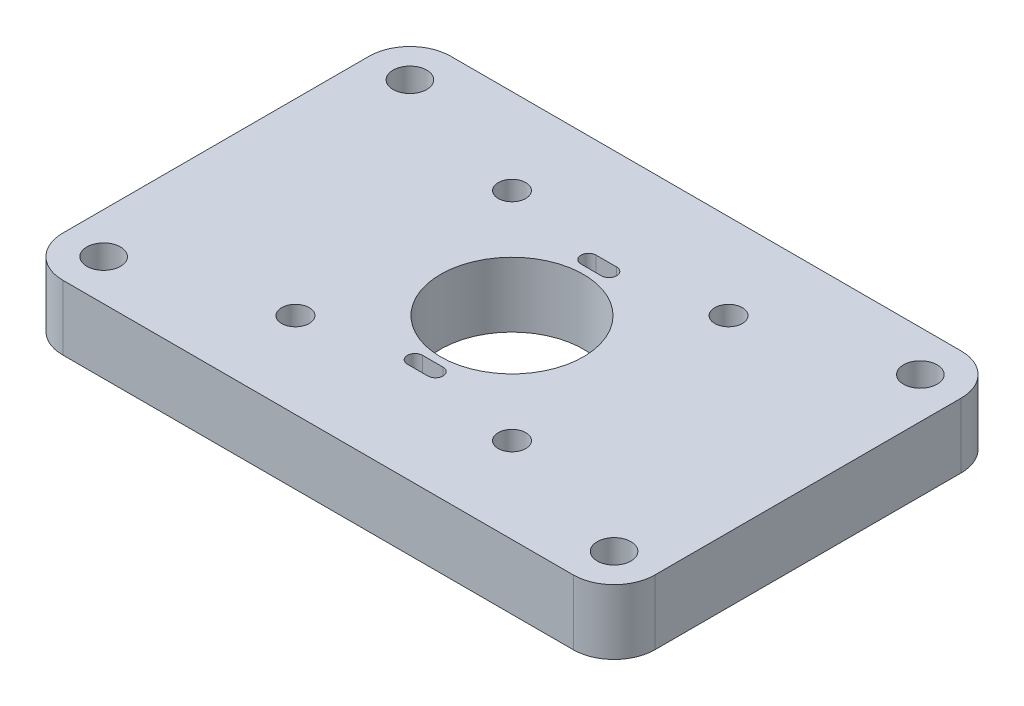
ISO-10303-21;
HEADER;
FILE_DESCRIPTION(('STEP AP214'),'2;1');
FILE_NAME('part.step','',(''),(''),'','','');
FILE_SCHEMA(('AUTOMOTIVE_DESIGN { 1 0 10303 214 1 1 1 1 }'));
ENDSEC;
DATA;
#1=APPLICATION_CONTEXT('core data for automotive mechanical design processes');
#2=APPLICATION_PROTOCOL_DEFINITION('international standard','automotive_design',2000,#1);
#3=PRODUCT_CONTEXT('',#1,'mechanical');
#4=PRODUCT('Part','Part','',(#3));
#5=PRODUCT_RELATED_PRODUCT_CATEGORY('part','',(#4));
#6=PRODUCT_DEFINITION_FORMATION('','',#4);
#7=PRODUCT_DEFINITION_CONTEXT('part definition',#1,'design');
#8=PRODUCT_DEFINITION('design','',#6,#7);
#9=PRODUCT_DEFINITION_SHAPE('','',#8);
#10=(LENGTH_UNIT() NAMED_UNIT(*) SI_UNIT(.MILLI.,.METRE.));
#11=(NAMED_UNIT(*) PLANE_ANGLE_UNIT() SI_UNIT($,.RADIAN.));
#12=(NAMED_UNIT(*) SI_UNIT($,.STERADIAN.) SOLID_ANGLE_UNIT());
#13=UNCERTAINTY_MEASURE_WITH_UNIT(LENGTH_MEASURE(1.E-05),#10,'distance_accuracy_value','');
#14=(GEOMETRIC_REPRESENTATION_CONTEXT(3) GLOBAL_UNCERTAINTY_ASSIGNED_CONTEXT((#13)) GLOBAL_UNIT_ASSIGNED_CONTEXT((#10,
#11,#12)) REPRESENTATION_CONTEXT('',''));
#15=CARTESIAN_POINT('',(0.,0.,0.));
#16=DIRECTION('',(0.,0.,1.));
#17=DIRECTION('',(1.,0.,0.));
#18=AXIS2_PLACEMENT_3D('',#15,#16,#17);
#19=CARTESIAN_POINT('',(0.,6.35,0.));
#20=DIRECTION('',(0.,1.,0.));
#21=DIRECTION('',(0.,0.,1.));
#22=AXIS2_PLACEMENT_3D('',#19,#20,#21);
#23=PLANE('',#22);
#24=CARTESIAN_POINT('',(14.3933982822019,6.35,-4.39339828220173));
#25=DIRECTION('',(0.,1.,0.));
#26=DIRECTION('',(0.,0.,1.));
#27=AXIS2_PLACEMENT_3D('',#24,#25,#26);
#28=CIRCLE('',#27,1.35);
#29=CARTESIAN_POINT('',(14.3933982822019,6.35,-3.04339828220173));
#30=VERTEX_POINT('',#29);
#31=EDGE_CURVE('E616',#30,#30,#28,.T.);
#32=ORIENTED_EDGE('',*,*,#31,.F.);
#33=EDGE_LOOP('',(#32));
#34=FACE_BOUND('',#33,.T.);
#35=CARTESIAN_POINT('',(35.6066017177983,6.35,-4.39339828220184));
#36=DIRECTION('',(0.,1.,0.));
#37=DIRECTION('',(0.,0.,1.));
#38=AXIS2_PLACEMENT_3D('',#35,#36,#37);
#39=CIRCLE('',#38,1.35);
#40=CARTESIAN_POINT('',(35.6066017177983,6.35,-3.04339828220184));
#41=VERTEX_POINT('',#40);
#42=EDGE_CURVE('E618',#41,#41,#39,.T.);
#43=ORIENTED_EDGE('',*,*,#42,.F.);
#44=EDGE_LOOP('',(#43));
#45=FACE_BOUND('',#44,.T.);
#46=CARTESIAN_POINT('',(35.6066017177982,6.35,-25.6066017177983));
#47=DIRECTION('',(0.,1.,0.));
#48=DIRECTION('',(0.,0.,1.));
#49=AXIS2_PLACEMENT_3D('',#46,#47,#48);
#50=CIRCLE('',#49,1.35);
#51=CARTESIAN_POINT('',(35.6066017177982,6.35,-24.2566017177983));
#52=VERTEX_POINT('',#51);
#53=EDGE_CURVE('E624',#52,#52,#50,.T.);
#54=ORIENTED_EDGE('',*,*,#53,.F.);
#55=EDGE_LOOP('',(#54));
#56=FACE_BOUND('',#55,.T.);
#57=CARTESIAN_POINT('',(14.3933982822017,6.35,-25.6066017177982));
#58=DIRECTION('',(0.,1.,0.));
#59=DIRECTION('',(0.,0.,1.));
#60=AXIS2_PLACEMENT_3D('',#57,#58,#59);
#61=CIRCLE('',#60,1.35);
#62=CARTESIAN_POINT('',(14.3933982822017,6.35,-24.2566017177982));
#63=VERTEX_POINT('',#62);
#64=EDGE_CURVE('E169',#63,#63,#61,.T.);
#65=ORIENTED_EDGE('',*,*,#64,.F.);
#66=EDGE_LOOP('',(#65));
#67=FACE_BOUND('',#66,.T.);
#68=CARTESIAN_POINT('',(24.,6.35,-6.499999982));
#69=DIRECTION('',(0.,1.,0.));
#70=DIRECTION('',(0.,0.,-1.));
#71=AXIS2_PLACEMENT_3D('',#68,#69,#70);
#72=CIRCLE('',#71,0.750000000000001);
#73=CARTESIAN_POINT('',(24.,6.35,-7.249999982));
#74=VERTEX_POINT('',#73);
#75=CARTESIAN_POINT('',(24.,6.35,-5.749999982));
#76=VERTEX_POINT('',#75);
#77=EDGE_CURVE('E48',#74,#76,#72,.T.);
#78=ORIENTED_EDGE('',*,*,#77,.F.);
#79=DIRECTION('',(-1.,0.,0.));
#80=VECTOR('',#79,1.);
#81=CARTESIAN_POINT('',(24.,6.35,-7.249999982));
#82=LINE('',#81,#80);
#83=CARTESIAN_POINT('',(26.,6.35,-7.249999982));
#84=VERTEX_POINT('',#83);
#85=EDGE_CURVE('E163',#84,#74,#82,.T.);
#86=ORIENTED_EDGE('',*,*,#85,.F.);
#87=CARTESIAN_POINT('',(26.,6.35,-6.499999982));
#88=DIRECTION('',(0.,1.,0.));
#89=DIRECTION('',(0.,0.,-1.));
#90=AXIS2_PLACEMENT_3D('',#87,#88,#89);
#91=CIRCLE('',#90,0.750000000000001);
#92=CARTESIAN_POINT('',(26.,6.35,-5.749999982));
#93=VERTEX_POINT('',#92);
#94=EDGE_CURVE('E166',#93,#84,#91,.T.);
#95=ORIENTED_EDGE('',*,*,#94,.F.);
#96=DIRECTION('',(1.,0.,0.));
#97=VECTOR('',#96,1.);
#98=CARTESIAN_POINT('',(24.,6.35,-5.749999982));
#99=LINE('',#98,#97);
#100=EDGE_CURVE('E175',#76,#93,#99,.T.);
#101=ORIENTED_EDGE('',*,*,#100,.F.);
#102=EDGE_LOOP('',(#78,#86,#95,#101));
#103=FACE_BOUND('',#102,.T.);
#104=CARTESIAN_POINT('',(24.,6.35,-23.500000018));
#105=DIRECTION('',(0.,1.,0.));
#106=DIRECTION('',(0.,0.,1.));
#107=AXIS2_PLACEMENT_3D('',#104,#105,#106);
#108=CIRCLE('',#107,0.750000000000001);
#109=CARTESIAN_POINT('',(24.,6.35,-24.250000018));
#110=VERTEX_POINT('',#109);
#111=CARTESIAN_POINT('',(24.,6.35,-22.750000018));
#112=VERTEX_POINT('',#111);
#113=EDGE_CURVE('E182',#110,#112,#108,.T.);
#114=ORIENTED_EDGE('',*,*,#113,.F.);
#115=DIRECTION('',(-1.,0.,0.));
#116=VECTOR('',#115,1.);
#117=CARTESIAN_POINT('',(24.,6.35,-24.250000018));
#118=LINE('',#117,#116);
#119=CARTESIAN_POINT('',(26.,6.35,-24.250000018));
#120=VERTEX_POINT('',#119);
#121=EDGE_CURVE('E190',#120,#110,#118,.T.);
#122=ORIENTED_EDGE('',*,*,#121,.F.);
#123=CARTESIAN_POINT('',(26.,6.35,-23.500000018));
#124=DIRECTION('',(0.,1.,0.));
#125=DIRECTION('',(0.,0.,1.));
#126=AXIS2_PLACEMENT_3D('',#123,#124,#125);
#127=CIRCLE('',#126,0.750000000000001);
#128=CARTESIAN_POINT('',(26.,6.35,-22.750000018));
#129=VERTEX_POINT('',#128);
#130=EDGE_CURVE('E204',#129,#120,#127,.T.);
#131=ORIENTED_EDGE('',*,*,#130,.F.);
#132=DIRECTION('',(1.,0.,0.));
#133=VECTOR('',#132,1.);
#134=CARTESIAN_POINT('',(24.,6.35,-22.750000018));
#135=LINE('',#134,#133);
#136=EDGE_CURVE('E201',#112,#129,#135,.T.);
#137=ORIENTED_EDGE('',*,*,#136,.F.);
#138=EDGE_LOOP('',(#114,#122,#131,#137));
#139=FACE_BOUND('',#138,.T.);
#140=CARTESIAN_POINT('',(50.,6.35,0.));
#141=DIRECTION('',(0.,1.,0.));
#142=DIRECTION('',(0.,0.,1.));
#143=AXIS2_PLACEMENT_3D('',#140,#141,#142);
#144=CIRCLE('',#143,1.65);
#145=CARTESIAN_POINT('',(50.,6.35,1.65));
#146=VERTEX_POINT('',#145);
#147=EDGE_CURVE('E224',#146,#146,#144,.T.);
#148=ORIENTED_EDGE('',*,*,#147,.F.);
#149=EDGE_LOOP('',(#148));
#150=FACE_BOUND('',#149,.T.);
#151=CARTESIAN_POINT('',(0.,6.35,-30.));
#152=DIRECTION('',(0.,1.,0.));
#153=DIRECTION('',(0.,0.,1.));
#154=AXIS2_PLACEMENT_3D('',#151,#152,#153);
#155=CIRCLE('',#154,1.65);
#156=CARTESIAN_POINT('',(0.,6.35,-28.35));
#157=VERTEX_POINT('',#156);
#158=EDGE_CURVE('E236',#157,#157,#155,.T.);
#159=ORIENTED_EDGE('',*,*,#158,.F.);
#160=EDGE_LOOP('',(#159));
#161=FACE_BOUND('',#160,.T.);
#162=DIRECTION('',(-1.,0.,0.));
#163=VECTOR('',#162,1.);
#164=CARTESIAN_POINT('',(-4.,6.35,-34.));
#165=LINE('',#164,#163);
#166=CARTESIAN_POINT('',(50.,6.35,-34.));
#167=VERTEX_POINT('',#166);
#168=CARTESIAN_POINT('',(0.,6.35,-34.));
#169=VERTEX_POINT('',#168);
#170=EDGE_CURVE('E258',#167,#169,#165,.T.);
#171=ORIENTED_EDGE('',*,*,#170,.T.);
#172=CARTESIAN_POINT('',(0.,6.35,-30.));
#173=DIRECTION('',(0.,1.,0.));
#174=DIRECTION('',(0.,0.,1.));
#175=AXIS2_PLACEMENT_3D('',#172,#173,#174);
#176=CIRCLE('',#175,4.);
#177=CARTESIAN_POINT('',(-4.,6.35,-30.));
#178=VERTEX_POINT('',#177);
#179=EDGE_CURVE('E295',#169,#178,#176,.T.);
#180=ORIENTED_EDGE('',*,*,#179,.T.);
#181=DIRECTION('',(0.,0.,1.));
#182=VECTOR('',#181,1.);
#183=CARTESIAN_POINT('',(-4.,6.35,-34.));
#184=LINE('',#183,#182);
#185=CARTESIAN_POINT('',(-4.,6.35,0.));
#186=VERTEX_POINT('',#185);
#187=EDGE_CURVE('E248',#178,#186,#184,.T.);
#188=ORIENTED_EDGE('',*,*,#187,.T.);
#189=CARTESIAN_POINT('',(0.,6.35,0.));
#190=DIRECTION('',(0.,1.,0.));
#191=DIRECTION('',(0.,0.,1.));
#192=AXIS2_PLACEMENT_3D('',#189,#190,#191);
#193=CIRCLE('',#192,4.);
#194=CARTESIAN_POINT('',(0.,6.35,4.));
#195=VERTEX_POINT('',#194);
#196=EDGE_CURVE('E289',#186,#195,#193,.T.);
#197=ORIENTED_EDGE('',*,*,#196,.T.);
#198=DIRECTION('',(1.,0.,0.));
#199=VECTOR('',#198,1.);
#200=CARTESIAN_POINT('',(-4.,6.35,4.));
#201=LINE('',#200,#199);
#202=CARTESIAN_POINT('',(50.,6.35,4.));
#203=VERTEX_POINT('',#202);
#204=EDGE_CURVE('E251',#195,#203,#201,.T.);
#205=ORIENTED_EDGE('',*,*,#204,.T.);
#206=CARTESIAN_POINT('',(50.,6.35,0.));
#207=DIRECTION('',(0.,1.,0.));
#208=DIRECTION('',(0.,0.,1.));
#209=AXIS2_PLACEMENT_3D('',#206,#207,#208);
#210=CIRCLE('',#209,4.);
#211=CARTESIAN_POINT('',(54.,6.35,0.));
#212=VERTEX_POINT('',#211);
#213=EDGE_CURVE('E291',#203,#212,#210,.T.);
#214=ORIENTED_EDGE('',*,*,#213,.T.);
#215=DIRECTION('',(0.,0.,-1.));
#216=VECTOR('',#215,1.);
#217=CARTESIAN_POINT('',(54.,6.35,-34.));
#218=LINE('',#217,#216);
#219=CARTESIAN_POINT('',(54.,6.35,-30.));
#220=VERTEX_POINT('',#219);
#221=EDGE_CURVE('E255',#212,#220,#218,.T.);
#222=ORIENTED_EDGE('',*,*,#221,.T.);
#223=CARTESIAN_POINT('',(50.,6.35,-30.));
#224=DIRECTION('',(0.,1.,0.));
#225=DIRECTION('',(0.,0.,1.));
#226=AXIS2_PLACEMENT_3D('',#223,#224,#225);
#227=CIRCLE('',#226,4.);
#228=EDGE_CURVE('E293',#220,#167,#227,.T.);
#229=ORIENTED_EDGE('',*,*,#228,.T.);
#230=EDGE_LOOP('',(#171,#180,#188,#197,#205,#214,#222,#229));
#231=FACE_BOUND('',#230,.T.);
#232=CARTESIAN_POINT('',(25.,6.35,-15.));
#233=DIRECTION('',(0.,1.,0.));
#234=DIRECTION('',(0.,0.,1.));
#235=AXIS2_PLACEMENT_3D('',#232,#233,#234);
#236=CIRCLE('',#235,7.);
#237=CARTESIAN_POINT('',(25.,6.35,-8.));
#238=VERTEX_POINT('',#237);
#239=EDGE_CURVE('E242',#238,#238,#236,.T.);
#240=ORIENTED_EDGE('',*,*,#239,.F.);
#241=EDGE_LOOP('',(#240));
#242=FACE_BOUND('',#241,.T.);
#243=CARTESIAN_POINT('',(50.,6.35,-30.));
#244=DIRECTION('',(0.,1.,0.));
#245=DIRECTION('',(0.,0.,1.));
#246=AXIS2_PLACEMENT_3D('',#243,#244,#245);
#247=CIRCLE('',#246,1.65);
#248=CARTESIAN_POINT('',(50.,6.35,-28.35));
#249=VERTEX_POINT('',#248);
#250=EDGE_CURVE('E230',#249,#249,#247,.T.);
#251=ORIENTED_EDGE('',*,*,#250,.F.);
#252=EDGE_LOOP('',(#251));
#253=FACE_BOUND('',#252,.T.);
#254=CARTESIAN_POINT('',(0.,6.35,0.));
#255=DIRECTION('',(0.,1.,0.));
#256=DIRECTION('',(0.,0.,1.));
#257=AXIS2_PLACEMENT_3D('',#254,#255,#256);
#258=CIRCLE('',#257,1.65);
#259=CARTESIAN_POINT('',(0.,6.35,1.65));
#260=VERTEX_POINT('',#259);
#261=EDGE_CURVE('E218',#260,#260,#258,.T.);
#262=ORIENTED_EDGE('',*,*,#261,.F.);
#263=EDGE_LOOP('',(#262));
#264=FACE_BOUND('',#263,.T.);
#265=ADVANCED_FACE('F33',(#34,#45,#56,#67,#103,#139,#150,#161,#231,#242,#253,#264),#23,.T.);
#266=CARTESIAN_POINT('',(0.,0.,0.));
#267=DIRECTION('',(0.,1.,0.));
#268=DIRECTION('',(0.,0.,1.));
#269=AXIS2_PLACEMENT_3D('',#266,#267,#268);
#270=PLANE('',#269);
#271=CARTESIAN_POINT('',(14.3933982822019,0.,-4.39339828220173));
#272=DIRECTION('',(0.,1.,0.));
#273=DIRECTION('',(0.,0.,1.));
#274=AXIS2_PLACEMENT_3D('',#271,#272,#273);
#275=CIRCLE('',#274,1.35);
#276=CARTESIAN_POINT('',(14.3933982822019,0.,-3.04339828220173));
#277=VERTEX_POINT('',#276);
#278=EDGE_CURVE('E614',#277,#277,#275,.T.);
#279=ORIENTED_EDGE('',*,*,#278,.T.);
#280=EDGE_LOOP('',(#279));
#281=FACE_BOUND('',#280,.T.);
#282=CARTESIAN_POINT('',(35.6066017177983,0.,-4.39339828220184));
#283=DIRECTION('',(0.,1.,0.));
#284=DIRECTION('',(0.,0.,1.));
#285=AXIS2_PLACEMENT_3D('',#282,#283,#284);
#286=CIRCLE('',#285,1.35);
#287=CARTESIAN_POINT('',(35.6066017177983,0.,-3.04339828220184));
#288=VERTEX_POINT('',#287);
#289=EDGE_CURVE('E621',#288,#288,#286,.T.);
#290=ORIENTED_EDGE('',*,*,#289,.T.);
#291=EDGE_LOOP('',(#290));
#292=FACE_BOUND('',#291,.T.);
#293=CARTESIAN_POINT('',(35.6066017177982,0.,-25.6066017177983));
#294=DIRECTION('',(0.,1.,0.));
#295=DIRECTION('',(0.,0.,1.));
#296=AXIS2_PLACEMENT_3D('',#293,#294,#295);
#297=CIRCLE('',#296,1.35);
#298=CARTESIAN_POINT('',(35.6066017177982,0.,-24.2566017177983));
#299=VERTEX_POINT('',#298);
#300=EDGE_CURVE('E627',#299,#299,#297,.T.);
#301=ORIENTED_EDGE('',*,*,#300,.T.);
#302=EDGE_LOOP('',(#301));
#303=FACE_BOUND('',#302,.T.);
#304=CARTESIAN_POINT('',(14.3933982822017,0.,-25.6066017177982));
#305=DIRECTION('',(0.,1.,0.));
#306=DIRECTION('',(0.,0.,1.));
#307=AXIS2_PLACEMENT_3D('',#304,#305,#306);
#308=CIRCLE('',#307,1.35);
#309=CARTESIAN_POINT('',(14.3933982822017,0.,-24.2566017177982));
#310=VERTEX_POINT('',#309);
#311=EDGE_CURVE('E176',#310,#310,#308,.T.);
#312=ORIENTED_EDGE('',*,*,#311,.T.);
#313=EDGE_LOOP('',(#312));
#314=FACE_BOUND('',#313,.T.);
#315=DIRECTION('',(-1.,0.,0.));
#316=VECTOR('',#315,1.);
#317=CARTESIAN_POINT('',(24.,0.,-7.249999982));
#318=LINE('',#317,#316);
#319=CARTESIAN_POINT('',(26.,0.,-7.249999982));
#320=VERTEX_POINT('',#319);
#321=CARTESIAN_POINT('',(24.,0.,-7.249999982));
#322=VERTEX_POINT('',#321);
#323=EDGE_CURVE('E153',#320,#322,#318,.T.);
#324=ORIENTED_EDGE('',*,*,#323,.T.);
#325=CARTESIAN_POINT('',(24.,0.,-6.499999982));
#326=DIRECTION('',(0.,1.,0.));
#327=DIRECTION('',(0.,0.,-1.));
#328=AXIS2_PLACEMENT_3D('',#325,#326,#327);
#329=CIRCLE('',#328,0.750000000000001);
#330=CARTESIAN_POINT('',(24.,0.,-5.749999982));
#331=VERTEX_POINT('',#330);
#332=EDGE_CURVE('E147',#322,#331,#329,.T.);
#333=ORIENTED_EDGE('',*,*,#332,.T.);
#334=DIRECTION('',(1.,0.,0.));
#335=VECTOR('',#334,1.);
#336=CARTESIAN_POINT('',(24.,0.,-5.749999982));
#337=LINE('',#336,#335);
#338=CARTESIAN_POINT('',(26.,0.,-5.749999982));
#339=VERTEX_POINT('',#338);
#340=EDGE_CURVE('E156',#331,#339,#337,.T.);
#341=ORIENTED_EDGE('',*,*,#340,.T.);
#342=CARTESIAN_POINT('',(26.,0.,-6.499999982));
#343=DIRECTION('',(0.,1.,0.));
#344=DIRECTION('',(0.,0.,-1.));
#345=AXIS2_PLACEMENT_3D('',#342,#343,#344);
#346=CIRCLE('',#345,0.750000000000001);
#347=EDGE_CURVE('E56',#339,#320,#346,.T.);
#348=ORIENTED_EDGE('',*,*,#347,.T.);
#349=EDGE_LOOP('',(#324,#333,#341,#348));
#350=FACE_BOUND('',#349,.T.);
#351=DIRECTION('',(-1.,0.,0.));
#352=VECTOR('',#351,1.);
#353=CARTESIAN_POINT('',(24.,0.,-24.250000018));
#354=LINE('',#353,#352);
#355=CARTESIAN_POINT('',(26.,0.,-24.250000018));
#356=VERTEX_POINT('',#355);
#357=CARTESIAN_POINT('',(24.,0.,-24.250000018));
#358=VERTEX_POINT('',#357);
#359=EDGE_CURVE('E196',#356,#358,#354,.T.);
#360=ORIENTED_EDGE('',*,*,#359,.T.);
#361=CARTESIAN_POINT('',(24.,0.,-23.500000018));
#362=DIRECTION('',(0.,1.,0.));
#363=DIRECTION('',(0.,0.,1.));
#364=AXIS2_PLACEMENT_3D('',#361,#362,#363);
#365=CIRCLE('',#364,0.750000000000001);
#366=CARTESIAN_POINT('',(24.,0.,-22.750000018));
#367=VERTEX_POINT('',#366);
#368=EDGE_CURVE('E186',#358,#367,#365,.T.);
#369=ORIENTED_EDGE('',*,*,#368,.T.);
#370=DIRECTION('',(1.,0.,0.));
#371=VECTOR('',#370,1.);
#372=CARTESIAN_POINT('',(24.,0.,-22.750000018));
#373=LINE('',#372,#371);
#374=CARTESIAN_POINT('',(26.,0.,-22.750000018));
#375=VERTEX_POINT('',#374);
#376=EDGE_CURVE('E189',#367,#375,#373,.T.);
#377=ORIENTED_EDGE('',*,*,#376,.T.);
#378=CARTESIAN_POINT('',(26.,0.,-23.500000018));
#379=DIRECTION('',(0.,1.,0.));
#380=DIRECTION('',(0.,0.,1.));
#381=AXIS2_PLACEMENT_3D('',#378,#379,#380);
#382=CIRCLE('',#381,0.750000000000001);
#383=EDGE_CURVE('E193',#375,#356,#382,.T.);
#384=ORIENTED_EDGE('',*,*,#383,.T.);
#385=EDGE_LOOP('',(#360,#369,#377,#384));
#386=FACE_BOUND('',#385,.T.);
#387=CARTESIAN_POINT('',(50.,0.,0.));
#388=DIRECTION('',(0.,1.,0.));
#389=DIRECTION('',(0.,0.,1.));
#390=AXIS2_PLACEMENT_3D('',#387,#388,#389);
#391=CIRCLE('',#390,1.65);
#392=CARTESIAN_POINT('',(50.,0.,1.65));
#393=VERTEX_POINT('',#392);
#394=EDGE_CURVE('E221',#393,#393,#391,.T.);
#395=ORIENTED_EDGE('',*,*,#394,.T.);
#396=EDGE_LOOP('',(#395));
#397=FACE_BOUND('',#396,.T.);
#398=CARTESIAN_POINT('',(0.,0.,-30.));
#399=DIRECTION('',(0.,1.,0.));
#400=DIRECTION('',(0.,0.,1.));
#401=AXIS2_PLACEMENT_3D('',#398,#399,#400);
#402=CIRCLE('',#401,1.65);
#403=CARTESIAN_POINT('',(0.,0.,-28.35));
#404=VERTEX_POINT('',#403);
#405=EDGE_CURVE('E233',#404,#404,#402,.T.);
#406=ORIENTED_EDGE('',*,*,#405,.T.);
#407=EDGE_LOOP('',(#406));
#408=FACE_BOUND('',#407,.T.);
#409=DIRECTION('',(0.,0.,1.));
#410=VECTOR('',#409,1.);
#411=CARTESIAN_POINT('',(-4.,0.,-34.));
#412=LINE('',#411,#410);
#413=CARTESIAN_POINT('',(-4.,0.,-30.));
#414=VERTEX_POINT('',#413);
#415=CARTESIAN_POINT('',(-4.,0.,0.));
#416=VERTEX_POINT('',#415);
#417=EDGE_CURVE('E245',#414,#416,#412,.T.);
#418=ORIENTED_EDGE('',*,*,#417,.F.);
#419=CARTESIAN_POINT('',(0.,0.,-30.));
#420=DIRECTION('',(0.,1.,0.));
#421=DIRECTION('',(0.,0.,1.));
#422=AXIS2_PLACEMENT_3D('',#419,#420,#421);
#423=CIRCLE('',#422,4.);
#424=CARTESIAN_POINT('',(0.,0.,-34.));
#425=VERTEX_POINT('',#424);
#426=EDGE_CURVE('E282',#414,#425,#423,.F.);
#427=ORIENTED_EDGE('',*,*,#426,.T.);
#428=DIRECTION('',(-1.,0.,0.));
#429=VECTOR('',#428,1.);
#430=CARTESIAN_POINT('',(-4.,0.,-34.));
#431=LINE('',#430,#429);
#432=CARTESIAN_POINT('',(50.,0.,-34.));
#433=VERTEX_POINT('',#432);
#434=EDGE_CURVE('E252',#433,#425,#431,.T.);
#435=ORIENTED_EDGE('',*,*,#434,.F.);
#436=CARTESIAN_POINT('',(50.,0.,-30.));
#437=DIRECTION('',(0.,1.,0.));
#438=DIRECTION('',(0.,0.,1.));
#439=AXIS2_PLACEMENT_3D('',#436,#437,#438);
#440=CIRCLE('',#439,4.);
#441=CARTESIAN_POINT('',(54.,0.,-30.));
#442=VERTEX_POINT('',#441);
#443=EDGE_CURVE('E280',#433,#442,#440,.F.);
#444=ORIENTED_EDGE('',*,*,#443,.T.);
#445=DIRECTION('',(0.,0.,-1.));
#446=VECTOR('',#445,1.);
#447=CARTESIAN_POINT('',(54.,0.,-34.));
#448=LINE('',#447,#446);
#449=CARTESIAN_POINT('',(54.,0.,0.));
#450=VERTEX_POINT('',#449);
#451=EDGE_CURVE('E267',#450,#442,#448,.T.);
#452=ORIENTED_EDGE('',*,*,#451,.F.);
#453=CARTESIAN_POINT('',(50.,0.,0.));
#454=DIRECTION('',(0.,1.,0.));
#455=DIRECTION('',(0.,0.,1.));
#456=AXIS2_PLACEMENT_3D('',#453,#454,#455);
#457=CIRCLE('',#456,4.);
#458=CARTESIAN_POINT('',(50.,0.,4.));
#459=VERTEX_POINT('',#458);
#460=EDGE_CURVE('E278',#450,#459,#457,.F.);
#461=ORIENTED_EDGE('',*,*,#460,.T.);
#462=DIRECTION('',(1.,0.,0.));
#463=VECTOR('',#462,1.);
#464=CARTESIAN_POINT('',(-4.,0.,4.));
#465=LINE('',#464,#463);
#466=CARTESIAN_POINT('',(0.,0.,4.));
#467=VERTEX_POINT('',#466);
#468=EDGE_CURVE('E264',#467,#459,#465,.T.);
#469=ORIENTED_EDGE('',*,*,#468,.F.);
#470=CARTESIAN_POINT('',(0.,0.,0.));
#471=DIRECTION('',(0.,1.,0.));
#472=DIRECTION('',(0.,0.,1.));
#473=AXIS2_PLACEMENT_3D('',#470,#471,#472);
#474=CIRCLE('',#473,4.);
#475=EDGE_CURVE('E276',#467,#416,#474,.F.);
#476=ORIENTED_EDGE('',*,*,#475,.T.);
#477=EDGE_LOOP('',(#418,#427,#435,#444,#452,#461,#469,#476));
#478=FACE_BOUND('',#477,.T.);
#479=CARTESIAN_POINT('',(25.,0.,-15.));
#480=DIRECTION('',(0.,1.,0.));
#481=DIRECTION('',(0.,0.,1.));
#482=AXIS2_PLACEMENT_3D('',#479,#480,#481);
#483=CIRCLE('',#482,7.);
#484=CARTESIAN_POINT('',(25.,0.,-8.));
#485=VERTEX_POINT('',#484);
#486=EDGE_CURVE('E239',#485,#485,#483,.T.);
#487=ORIENTED_EDGE('',*,*,#486,.T.);
#488=EDGE_LOOP('',(#487));
#489=FACE_BOUND('',#488,.T.);
#490=CARTESIAN_POINT('',(50.,0.,-30.));
#491=DIRECTION('',(0.,1.,0.));
#492=DIRECTION('',(0.,0.,1.));
#493=AXIS2_PLACEMENT_3D('',#490,#491,#492);
#494=CIRCLE('',#493,1.65);
#495=CARTESIAN_POINT('',(50.,0.,-28.35));
#496=VERTEX_POINT('',#495);
#497=EDGE_CURVE('E227',#496,#496,#494,.T.);
#498=ORIENTED_EDGE('',*,*,#497,.T.);
#499=EDGE_LOOP('',(#498));
#500=FACE_BOUND('',#499,.T.);
#501=CARTESIAN_POINT('',(0.,0.,0.));
#502=DIRECTION('',(0.,1.,0.));
#503=DIRECTION('',(0.,0.,1.));
#504=AXIS2_PLACEMENT_3D('',#501,#502,#503);
#505=CIRCLE('',#504,1.65);
#506=CARTESIAN_POINT('',(0.,0.,1.65));
#507=VERTEX_POINT('',#506);
#508=EDGE_CURVE('E211',#507,#507,#505,.T.);
#509=ORIENTED_EDGE('',*,*,#508,.T.);
#510=EDGE_LOOP('',(#509));
#511=FACE_BOUND('',#510,.T.);
#512=ADVANCED_FACE('F160',(#281,#292,#303,#314,#350,#386,#397,#408,#478,#489,#500,#511),#270,.F.);
#513=CARTESIAN_POINT('',(-4.,6.35,-34.));
#514=DIRECTION('',(1.,0.,0.));
#515=DIRECTION('',(0.,0.,-1.));
#516=AXIS2_PLACEMENT_3D('',#513,#514,#515);
#517=PLANE('',#516);
#518=ORIENTED_EDGE('',*,*,#187,.F.);
#519=DIRECTION('',(0.,-1.,0.));
#520=VECTOR('',#519,1.);
#521=CARTESIAN_POINT('',(-4.,6.35,-30.));
#522=LINE('',#521,#520);
#523=EDGE_CURVE('E273',#178,#414,#522,.T.);
#524=ORIENTED_EDGE('',*,*,#523,.T.);
#525=ORIENTED_EDGE('',*,*,#417,.T.);
#526=DIRECTION('',(0.,-1.,0.));
#527=VECTOR('',#526,1.);
#528=CARTESIAN_POINT('',(-4.,6.35,0.));
#529=LINE('',#528,#527);
#530=EDGE_CURVE('E261',#416,#186,#529,.F.);
#531=ORIENTED_EDGE('',*,*,#530,.T.);
#532=EDGE_LOOP('',(#518,#524,#525,#531));
#533=FACE_BOUND('',#532,.T.);
#534=ADVANCED_FACE('F339',(#533),#517,.F.);
#535=CARTESIAN_POINT('',(-4.,6.35,4.));
#536=DIRECTION('',(0.,0.,-1.));
#537=DIRECTION('',(-1.,0.,0.));
#538=AXIS2_PLACEMENT_3D('',#535,#536,#537);
#539=PLANE('',#538);
#540=ORIENTED_EDGE('',*,*,#468,.T.);
#541=DIRECTION('',(0.,-1.,0.));
#542=VECTOR('',#541,1.);
#543=CARTESIAN_POINT('',(50.,6.35,4.));
#544=LINE('',#543,#542);
#545=EDGE_CURVE('E11',#459,#203,#544,.F.);
#546=ORIENTED_EDGE('',*,*,#545,.T.);
#547=ORIENTED_EDGE('',*,*,#204,.F.);
#548=DIRECTION('',(0.,-1.,0.));
#549=VECTOR('',#548,1.);
#550=CARTESIAN_POINT('',(0.,6.35,4.));
#551=LINE('',#550,#549);
#552=EDGE_CURVE('E41',#195,#467,#551,.T.);
#553=ORIENTED_EDGE('',*,*,#552,.T.);
#554=EDGE_LOOP('',(#540,#546,#547,#553));
#555=FACE_BOUND('',#554,.T.);
#556=ADVANCED_FACE('F306',(#555),#539,.F.);
#557=CARTESIAN_POINT('',(54.,6.35,-34.));
#558=DIRECTION('',(-1.,0.,0.));
#559=DIRECTION('',(0.,0.,1.));
#560=AXIS2_PLACEMENT_3D('',#557,#558,#559);
#561=PLANE('',#560);
#562=ORIENTED_EDGE('',*,*,#451,.T.);
#563=DIRECTION('',(0.,-1.,0.));
#564=VECTOR('',#563,1.);
#565=CARTESIAN_POINT('',(54.,6.35,-30.));
#566=LINE('',#565,#564);
#567=EDGE_CURVE('E300',#442,#220,#566,.F.);
#568=ORIENTED_EDGE('',*,*,#567,.T.);
#569=ORIENTED_EDGE('',*,*,#221,.F.);
#570=DIRECTION('',(0.,-1.,0.));
#571=VECTOR('',#570,1.);
#572=CARTESIAN_POINT('',(54.,6.35,0.));
#573=LINE('',#572,#571);
#574=EDGE_CURVE('E297',#212,#450,#573,.T.);
#575=ORIENTED_EDGE('',*,*,#574,.T.);
#576=EDGE_LOOP('',(#562,#568,#569,#575));
#577=FACE_BOUND('',#576,.T.);
#578=ADVANCED_FACE('F320',(#577),#561,.F.);
#579=CARTESIAN_POINT('',(-4.,6.35,-34.));
#580=DIRECTION('',(0.,0.,1.));
#581=DIRECTION('',(1.,0.,0.));
#582=AXIS2_PLACEMENT_3D('',#579,#580,#581);
#583=PLANE('',#582);
#584=ORIENTED_EDGE('',*,*,#434,.T.);
#585=DIRECTION('',(0.,-1.,0.));
#586=VECTOR('',#585,1.);
#587=CARTESIAN_POINT('',(0.,6.35,-34.));
#588=LINE('',#587,#586);
#589=EDGE_CURVE('E287',#425,#169,#588,.F.);
#590=ORIENTED_EDGE('',*,*,#589,.T.);
#591=ORIENTED_EDGE('',*,*,#170,.F.);
#592=DIRECTION('',(0.,-1.,0.));
#593=VECTOR('',#592,1.);
#594=CARTESIAN_POINT('',(50.,6.35,-34.));
#595=LINE('',#594,#593);
#596=EDGE_CURVE('E284',#167,#433,#595,.T.);
#597=ORIENTED_EDGE('',*,*,#596,.T.);
#598=EDGE_LOOP('',(#584,#590,#591,#597));
#599=FACE_BOUND('',#598,.T.);
#600=ADVANCED_FACE('F331',(#599),#583,.F.);
#601=CARTESIAN_POINT('',(25.,6.35,-15.));
#602=DIRECTION('',(0.,-1.,0.));
#603=DIRECTION('',(0.,0.,-1.));
#604=AXIS2_PLACEMENT_3D('',#601,#602,#603);
#605=CYLINDRICAL_SURFACE('',#604,7.);
#606=ORIENTED_EDGE('',*,*,#239,.T.);
#607=EDGE_LOOP('',(#606));
#608=FACE_BOUND('',#607,.T.);
#609=ORIENTED_EDGE('',*,*,#486,.F.);
#610=EDGE_LOOP('',(#609));
#611=FACE_BOUND('',#610,.T.);
#612=ADVANCED_FACE('F361',(#608,#611),#605,.F.);
#613=CARTESIAN_POINT('',(0.,6.35,-30.));
#614=DIRECTION('',(0.,-1.,0.));
#615=DIRECTION('',(0.,0.,-1.));
#616=AXIS2_PLACEMENT_3D('',#613,#614,#615);
#617=CYLINDRICAL_SURFACE('',#616,1.65);
#618=ORIENTED_EDGE('',*,*,#158,.T.);
#619=EDGE_LOOP('',(#618));
#620=FACE_BOUND('',#619,.T.);
#621=ORIENTED_EDGE('',*,*,#405,.F.);
#622=EDGE_LOOP('',(#621));
#623=FACE_BOUND('',#622,.T.);
#624=ADVANCED_FACE('F525',(#620,#623),#617,.F.);
#625=CARTESIAN_POINT('',(50.,6.35,-30.));
#626=DIRECTION('',(0.,-1.,0.));
#627=DIRECTION('',(0.,0.,-1.));
#628=AXIS2_PLACEMENT_3D('',#625,#626,#627);
#629=CYLINDRICAL_SURFACE('',#628,1.65);
#630=ORIENTED_EDGE('',*,*,#250,.T.);
#631=EDGE_LOOP('',(#630));
#632=FACE_BOUND('',#631,.T.);
#633=ORIENTED_EDGE('',*,*,#497,.F.);
#634=EDGE_LOOP('',(#633));
#635=FACE_BOUND('',#634,.T.);
#636=ADVANCED_FACE('F522',(#632,#635),#629,.F.);
#637=CARTESIAN_POINT('',(50.,6.35,0.));
#638=DIRECTION('',(0.,-1.,0.));
#639=DIRECTION('',(0.,0.,-1.));
#640=AXIS2_PLACEMENT_3D('',#637,#638,#639);
#641=CYLINDRICAL_SURFACE('',#640,1.65);
#642=ORIENTED_EDGE('',*,*,#147,.T.);
#643=EDGE_LOOP('',(#642));
#644=FACE_BOUND('',#643,.T.);
#645=ORIENTED_EDGE('',*,*,#394,.F.);
#646=EDGE_LOOP('',(#645));
#647=FACE_BOUND('',#646,.T.);
#648=ADVANCED_FACE('F518',(#644,#647),#641,.F.);
#649=CARTESIAN_POINT('',(0.,6.35,0.));
#650=DIRECTION('',(0.,-1.,0.));
#651=DIRECTION('',(0.,0.,-1.));
#652=AXIS2_PLACEMENT_3D('',#649,#650,#651);
#653=CYLINDRICAL_SURFACE('',#652,1.65);
#654=ORIENTED_EDGE('',*,*,#261,.T.);
#655=EDGE_LOOP('',(#654));
#656=FACE_BOUND('',#655,.T.);
#657=ORIENTED_EDGE('',*,*,#508,.F.);
#658=EDGE_LOOP('',(#657));
#659=FACE_BOUND('',#658,.T.);
#660=ADVANCED_FACE('F374',(#656,#659),#653,.F.);
#661=CARTESIAN_POINT('',(0.,6.35,-30.));
#662=DIRECTION('',(0.,-1.,0.));
#663=DIRECTION('',(0.,0.,-1.));
#664=AXIS2_PLACEMENT_3D('',#661,#662,#663);
#665=CYLINDRICAL_SURFACE('',#664,4.);
#666=ORIENTED_EDGE('',*,*,#179,.F.);
#667=ORIENTED_EDGE('',*,*,#589,.F.);
#668=ORIENTED_EDGE('',*,*,#426,.F.);
#669=ORIENTED_EDGE('',*,*,#523,.F.);
#670=EDGE_LOOP('',(#666,#667,#668,#669));
#671=FACE_BOUND('',#670,.T.);
#672=ADVANCED_FACE('F336',(#671),#665,.T.);
#673=CARTESIAN_POINT('',(50.,6.35,-30.));
#674=DIRECTION('',(0.,-1.,0.));
#675=DIRECTION('',(0.,0.,-1.));
#676=AXIS2_PLACEMENT_3D('',#673,#674,#675);
#677=CYLINDRICAL_SURFACE('',#676,4.);
#678=ORIENTED_EDGE('',*,*,#228,.F.);
#679=ORIENTED_EDGE('',*,*,#567,.F.);
#680=ORIENTED_EDGE('',*,*,#443,.F.);
#681=ORIENTED_EDGE('',*,*,#596,.F.);
#682=EDGE_LOOP('',(#678,#679,#680,#681));
#683=FACE_BOUND('',#682,.T.);
#684=ADVANCED_FACE('F328',(#683),#677,.T.);
#685=CARTESIAN_POINT('',(50.,6.35,0.));
#686=DIRECTION('',(0.,-1.,0.));
#687=DIRECTION('',(0.,0.,-1.));
#688=AXIS2_PLACEMENT_3D('',#685,#686,#687);
#689=CYLINDRICAL_SURFACE('',#688,4.);
#690=ORIENTED_EDGE('',*,*,#213,.F.);
#691=ORIENTED_EDGE('',*,*,#545,.F.);
#692=ORIENTED_EDGE('',*,*,#460,.F.);
#693=ORIENTED_EDGE('',*,*,#574,.F.);
#694=EDGE_LOOP('',(#690,#691,#692,#693));
#695=FACE_BOUND('',#694,.T.);
#696=ADVANCED_FACE('F317',(#695),#689,.T.);
#697=CARTESIAN_POINT('',(0.,6.35,0.));
#698=DIRECTION('',(0.,-1.,0.));
#699=DIRECTION('',(0.,0.,-1.));
#700=AXIS2_PLACEMENT_3D('',#697,#698,#699);
#701=CYLINDRICAL_SURFACE('',#700,4.);
#702=ORIENTED_EDGE('',*,*,#196,.F.);
#703=ORIENTED_EDGE('',*,*,#530,.F.);
#704=ORIENTED_EDGE('',*,*,#475,.F.);
#705=ORIENTED_EDGE('',*,*,#552,.F.);
#706=EDGE_LOOP('',(#702,#703,#704,#705));
#707=FACE_BOUND('',#706,.T.);
#708=ADVANCED_FACE('F35',(#707),#701,.T.);
#709=CARTESIAN_POINT('',(24.,0.,-23.500000018));
#710=DIRECTION('',(0.,1.,0.));
#711=DIRECTION('',(0.,0.,1.));
#712=AXIS2_PLACEMENT_3D('',#709,#710,#711);
#713=CYLINDRICAL_SURFACE('',#712,0.750000000000001);
#714=ORIENTED_EDGE('',*,*,#113,.T.);
#715=DIRECTION('',(0.,1.,0.));
#716=VECTOR('',#715,1.);
#717=CARTESIAN_POINT('',(24.,0.,-22.750000018));
#718=LINE('',#717,#716);
#719=EDGE_CURVE('E199',#367,#112,#718,.T.);
#720=ORIENTED_EDGE('',*,*,#719,.F.);
#721=ORIENTED_EDGE('',*,*,#368,.F.);
#722=DIRECTION('',(0.,1.,0.));
#723=VECTOR('',#722,1.);
#724=CARTESIAN_POINT('',(24.,0.,-24.250000018));
#725=LINE('',#724,#723);
#726=EDGE_CURVE('E209',#358,#110,#725,.T.);
#727=ORIENTED_EDGE('',*,*,#726,.T.);
#728=EDGE_LOOP('',(#714,#720,#721,#727));
#729=FACE_BOUND('',#728,.T.);
#730=ADVANCED_FACE('F342',(#729),#713,.F.);
#731=CARTESIAN_POINT('',(24.,0.,-24.250000018));
#732=DIRECTION('',(0.,0.,-1.));
#733=DIRECTION('',(-1.,0.,0.));
#734=AXIS2_PLACEMENT_3D('',#731,#732,#733);
#735=PLANE('',#734);
#736=ORIENTED_EDGE('',*,*,#121,.T.);
#737=ORIENTED_EDGE('',*,*,#726,.F.);
#738=ORIENTED_EDGE('',*,*,#359,.F.);
#739=DIRECTION('',(0.,1.,0.));
#740=VECTOR('',#739,1.);
#741=CARTESIAN_POINT('',(26.,0.,-24.250000018));
#742=LINE('',#741,#740);
#743=EDGE_CURVE('E212',#356,#120,#742,.T.);
#744=ORIENTED_EDGE('',*,*,#743,.T.);
#745=EDGE_LOOP('',(#736,#737,#738,#744));
#746=FACE_BOUND('',#745,.T.);
#747=ADVANCED_FACE('F347',(#746),#735,.F.);
#748=CARTESIAN_POINT('',(26.,0.,-23.500000018));
#749=DIRECTION('',(0.,1.,0.));
#750=DIRECTION('',(0.,0.,1.));
#751=AXIS2_PLACEMENT_3D('',#748,#749,#750);
#752=CYLINDRICAL_SURFACE('',#751,0.750000000000001);
#753=ORIENTED_EDGE('',*,*,#130,.T.);
#754=ORIENTED_EDGE('',*,*,#743,.F.);
#755=ORIENTED_EDGE('',*,*,#383,.F.);
#756=DIRECTION('',(0.,1.,0.));
#757=VECTOR('',#756,1.);
#758=CARTESIAN_POINT('',(26.,0.,-22.750000018));
#759=LINE('',#758,#757);
#760=EDGE_CURVE('E214',#375,#129,#759,.T.);
#761=ORIENTED_EDGE('',*,*,#760,.T.);
#762=EDGE_LOOP('',(#753,#754,#755,#761));
#763=FACE_BOUND('',#762,.T.);
#764=ADVANCED_FACE('F404',(#763),#752,.F.);
#765=CARTESIAN_POINT('',(24.,0.,-22.750000018));
#766=DIRECTION('',(0.,0.,1.));
#767=DIRECTION('',(1.,0.,0.));
#768=AXIS2_PLACEMENT_3D('',#765,#766,#767);
#769=PLANE('',#768);
#770=ORIENTED_EDGE('',*,*,#136,.T.);
#771=ORIENTED_EDGE('',*,*,#760,.F.);
#772=ORIENTED_EDGE('',*,*,#376,.F.);
#773=ORIENTED_EDGE('',*,*,#719,.T.);
#774=EDGE_LOOP('',(#770,#771,#772,#773));
#775=FACE_BOUND('',#774,.T.);
#776=ADVANCED_FACE('F414',(#775),#769,.F.);
#777=CARTESIAN_POINT('',(24.,0.,-6.499999982));
#778=DIRECTION('',(0.,1.,0.));
#779=DIRECTION('',(0.,0.,1.));
#780=AXIS2_PLACEMENT_3D('',#777,#778,#779);
#781=CYLINDRICAL_SURFACE('',#780,0.750000000000001);
#782=ORIENTED_EDGE('',*,*,#77,.T.);
#783=DIRECTION('',(0.,1.,0.));
#784=VECTOR('',#783,1.);
#785=CARTESIAN_POINT('',(24.,0.,-5.749999982));
#786=LINE('',#785,#784);
#787=EDGE_CURVE('E143',#331,#76,#786,.T.);
#788=ORIENTED_EDGE('',*,*,#787,.F.);
#789=ORIENTED_EDGE('',*,*,#332,.F.);
#790=DIRECTION('',(0.,1.,0.));
#791=VECTOR('',#790,1.);
#792=CARTESIAN_POINT('',(24.,0.,-7.249999982));
#793=LINE('',#792,#791);
#794=EDGE_CURVE('E180',#322,#74,#793,.T.);
#795=ORIENTED_EDGE('',*,*,#794,.T.);
#796=EDGE_LOOP('',(#782,#788,#789,#795));
#797=FACE_BOUND('',#796,.T.);
#798=ADVANCED_FACE('F145',(#797),#781,.F.);
#799=CARTESIAN_POINT('',(24.,0.,-7.249999982));
#800=DIRECTION('',(0.,0.,-1.));
#801=DIRECTION('',(-1.,0.,0.));
#802=AXIS2_PLACEMENT_3D('',#799,#800,#801);
#803=PLANE('',#802);
#804=ORIENTED_EDGE('',*,*,#85,.T.);
#805=ORIENTED_EDGE('',*,*,#794,.F.);
#806=ORIENTED_EDGE('',*,*,#323,.F.);
#807=DIRECTION('',(0.,1.,0.));
#808=VECTOR('',#807,1.);
#809=CARTESIAN_POINT('',(26.,0.,-7.249999982));
#810=LINE('',#809,#808);
#811=EDGE_CURVE('E183',#320,#84,#810,.T.);
#812=ORIENTED_EDGE('',*,*,#811,.T.);
#813=EDGE_LOOP('',(#804,#805,#806,#812));
#814=FACE_BOUND('',#813,.T.);
#815=ADVANCED_FACE('F433',(#814),#803,.F.);
#816=CARTESIAN_POINT('',(26.,0.,-6.499999982));
#817=DIRECTION('',(0.,1.,0.));
#818=DIRECTION('',(0.,0.,1.));
#819=AXIS2_PLACEMENT_3D('',#816,#817,#818);
#820=CYLINDRICAL_SURFACE('',#819,0.750000000000001);
#821=ORIENTED_EDGE('',*,*,#94,.T.);
#822=ORIENTED_EDGE('',*,*,#811,.F.);
#823=ORIENTED_EDGE('',*,*,#347,.F.);
#824=DIRECTION('',(0.,1.,0.));
#825=VECTOR('',#824,1.);
#826=CARTESIAN_POINT('',(26.,0.,-5.749999982));
#827=LINE('',#826,#825);
#828=EDGE_CURVE('E152',#339,#93,#827,.T.);
#829=ORIENTED_EDGE('',*,*,#828,.T.);
#830=EDGE_LOOP('',(#821,#822,#823,#829));
#831=FACE_BOUND('',#830,.T.);
#832=ADVANCED_FACE('F442',(#831),#820,.F.);
#833=CARTESIAN_POINT('',(24.,0.,-5.749999982));
#834=DIRECTION('',(0.,0.,1.));
#835=DIRECTION('',(1.,0.,0.));
#836=AXIS2_PLACEMENT_3D('',#833,#834,#835);
#837=PLANE('',#836);
#838=ORIENTED_EDGE('',*,*,#100,.T.);
#839=ORIENTED_EDGE('',*,*,#828,.F.);
#840=ORIENTED_EDGE('',*,*,#340,.F.);
#841=ORIENTED_EDGE('',*,*,#787,.T.);
#842=EDGE_LOOP('',(#838,#839,#840,#841));
#843=FACE_BOUND('',#842,.T.);
#844=ADVANCED_FACE('F157',(#843),#837,.F.);
#845=CARTESIAN_POINT('',(14.3933982822017,0.,-25.6066017177982));
#846=DIRECTION('',(0.,1.,0.));
#847=DIRECTION('',(0.,0.,1.));
#848=AXIS2_PLACEMENT_3D('',#845,#846,#847);
#849=CYLINDRICAL_SURFACE('',#848,1.35);
#850=ORIENTED_EDGE('',*,*,#311,.F.);
#851=EDGE_LOOP('',(#850));
#852=FACE_BOUND('',#851,.T.);
#853=ORIENTED_EDGE('',*,*,#64,.T.);
#854=EDGE_LOOP('',(#853));
#855=FACE_BOUND('',#854,.T.);
#856=ADVANCED_FACE('F459',(#852,#855),#849,.F.);
#857=CARTESIAN_POINT('',(35.6066017177982,0.,-25.6066017177983));
#858=DIRECTION('',(0.,1.,0.));
#859=DIRECTION('',(0.,0.,1.));
#860=AXIS2_PLACEMENT_3D('',#857,#858,#859);
#861=CYLINDRICAL_SURFACE('',#860,1.35);
#862=ORIENTED_EDGE('',*,*,#300,.F.);
#863=EDGE_LOOP('',(#862));
#864=FACE_BOUND('',#863,.T.);
#865=ORIENTED_EDGE('',*,*,#53,.T.);
#866=EDGE_LOOP('',(#865));
#867=FACE_BOUND('',#866,.T.);
#868=ADVANCED_FACE('F480',(#864,#867),#861,.F.);
#869=CARTESIAN_POINT('',(35.6066017177983,0.,-4.39339828220184));
#870=DIRECTION('',(0.,1.,0.));
#871=DIRECTION('',(0.,0.,1.));
#872=AXIS2_PLACEMENT_3D('',#869,#870,#871);
#873=CYLINDRICAL_SURFACE('',#872,1.35);
#874=ORIENTED_EDGE('',*,*,#289,.F.);
#875=EDGE_LOOP('',(#874));
#876=FACE_BOUND('',#875,.T.);
#877=ORIENTED_EDGE('',*,*,#42,.T.);
#878=EDGE_LOOP('',(#877));
#879=FACE_BOUND('',#878,.T.);
#880=ADVANCED_FACE('F490',(#876,#879),#873,.F.);
#881=CARTESIAN_POINT('',(14.3933982822019,0.,-4.39339828220173));
#882=DIRECTION('',(0.,1.,0.));
#883=DIRECTION('',(0.,0.,1.));
#884=AXIS2_PLACEMENT_3D('',#881,#882,#883);
#885=CYLINDRICAL_SURFACE('',#884,1.35);
#886=ORIENTED_EDGE('',*,*,#278,.F.);
#887=EDGE_LOOP('',(#886));
#888=FACE_BOUND('',#887,.T.);
#889=ORIENTED_EDGE('',*,*,#31,.T.);
#890=EDGE_LOOP('',(#889));
#891=FACE_BOUND('',#890,.T.);
#892=ADVANCED_FACE('F500',(#888,#891),#885,.F.);
#893=CLOSED_SHELL('',(#265,#512,#534,#556,#578,#600,#612,#624,#636,#648,#660,#672,#684,#696,
#708,#730,#747,#764,#776,#798,#815,#832,#844,#856,#868,#880,#892));
#894=MANIFOLD_SOLID_BREP('B2',#893);
#895=ADVANCED_BREP_SHAPE_REPRESENTATION('',(#18,#894),#14);
#896=SHAPE_DEFINITION_REPRESENTATION(#9,#895);
ENDSEC;
END-ISO-10303-21;
